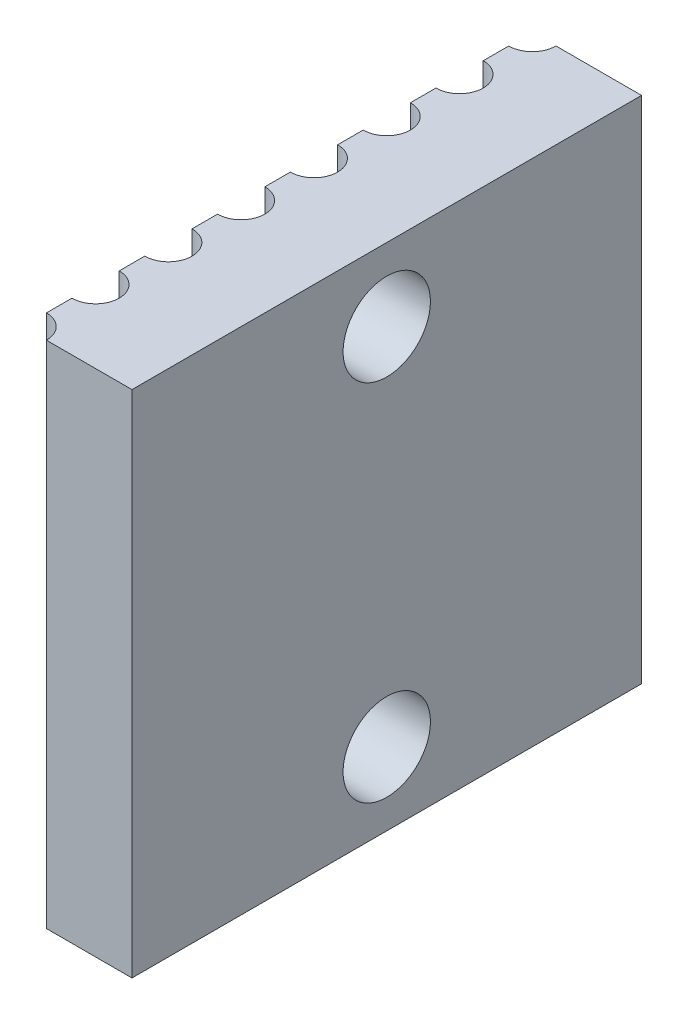
ISO-10303-21;
HEADER;
FILE_DESCRIPTION(('STEP AP214'),'2;1');
FILE_NAME('part.step','',(''),(''),'','','');
FILE_SCHEMA(('AUTOMOTIVE_DESIGN { 1 0 10303 214 1 1 1 1 }'));
ENDSEC;
DATA;
#1=APPLICATION_CONTEXT('core data for automotive mechanical design processes');
#2=APPLICATION_PROTOCOL_DEFINITION('international standard','automotive_design',2000,#1);
#3=PRODUCT_CONTEXT('',#1,'mechanical');
#4=PRODUCT('Part','Part','',(#3));
#5=PRODUCT_RELATED_PRODUCT_CATEGORY('part','',(#4));
#6=PRODUCT_DEFINITION_FORMATION('','',#4);
#7=PRODUCT_DEFINITION_CONTEXT('part definition',#1,'design');
#8=PRODUCT_DEFINITION('design','',#6,#7);
#9=PRODUCT_DEFINITION_SHAPE('','',#8);
#10=(LENGTH_UNIT() NAMED_UNIT(*) SI_UNIT(.MILLI.,.METRE.));
#11=(NAMED_UNIT(*) PLANE_ANGLE_UNIT() SI_UNIT($,.RADIAN.));
#12=(NAMED_UNIT(*) SI_UNIT($,.STERADIAN.) SOLID_ANGLE_UNIT());
#13=UNCERTAINTY_MEASURE_WITH_UNIT(LENGTH_MEASURE(1.E-05),#10,'distance_accuracy_value','');
#14=(GEOMETRIC_REPRESENTATION_CONTEXT(3) GLOBAL_UNCERTAINTY_ASSIGNED_CONTEXT((#13)) GLOBAL_UNIT_ASSIGNED_CONTEXT((#10,
#11,#12)) REPRESENTATION_CONTEXT('',''));
#15=CARTESIAN_POINT('',(0.,0.,0.));
#16=DIRECTION('',(0.,0.,1.));
#17=DIRECTION('',(1.,0.,0.));
#18=AXIS2_PLACEMENT_3D('',#15,#16,#17);
#19=CARTESIAN_POINT('',(0.,14.,14.));
#20=DIRECTION('',(1.,0.,0.));
#21=DIRECTION('',(0.,0.,-1.));
#22=AXIS2_PLACEMENT_3D('',#19,#20,#21);
#23=PLANE('',#22);
#24=DIRECTION('',(0.,-1.,0.));
#25=VECTOR('',#24,1.);
#26=CARTESIAN_POINT('',(0.,14.,6.65));
#27=LINE('',#26,#25);
#28=CARTESIAN_POINT('',(0.,13.1478240283249,6.65));
#29=VERTEX_POINT('',#28);
#30=CARTESIAN_POINT('',(0.,14.,6.65));
#31=VERTEX_POINT('',#30);
#32=EDGE_CURVE('E189',#29,#31,#27,.F.);
#33=ORIENTED_EDGE('',*,*,#32,.F.);
#34=CARTESIAN_POINT('',(0.,12.,7.));
#35=DIRECTION('',(1.,0.,0.));
#36=DIRECTION('',(0.,0.,-1.));
#37=AXIS2_PLACEMENT_3D('',#34,#35,#36);
#38=CIRCLE('',#37,1.19999999999999);
#39=CARTESIAN_POINT('',(0.,13.1478240283249,7.35));
#40=VERTEX_POINT('',#39);
#41=EDGE_CURVE('E11',#29,#40,#38,.T.);
#42=ORIENTED_EDGE('',*,*,#41,.T.);
#43=DIRECTION('',(0.,-1.,0.));
#44=VECTOR('',#43,1.);
#45=CARTESIAN_POINT('',(0.,14.,7.35));
#46=LINE('',#45,#44);
#47=CARTESIAN_POINT('',(0.,14.,7.35));
#48=VERTEX_POINT('',#47);
#49=EDGE_CURVE('E278',#48,#40,#46,.T.);
#50=ORIENTED_EDGE('',*,*,#49,.F.);
#51=DIRECTION('',(0.,0.,1.));
#52=VECTOR('',#51,1.);
#53=CARTESIAN_POINT('',(0.,14.,14.));
#54=LINE('',#53,#52);
#55=EDGE_CURVE('E198',#31,#48,#54,.T.);
#56=ORIENTED_EDGE('',*,*,#55,.F.);
#57=EDGE_LOOP('',(#33,#42,#50,#56));
#58=FACE_BOUND('',#57,.T.);
#59=ADVANCED_FACE('F31',(#58),#23,.F.);
#60=CARTESIAN_POINT('',(0.,10.8521759716751,7.35));
#61=VERTEX_POINT('',#60);
#62=CARTESIAN_POINT('',(0.,3.14782402832489,7.35));
#63=VERTEX_POINT('',#62);
#64=EDGE_CURVE('E52',#61,#63,#46,.T.);
#65=ORIENTED_EDGE('',*,*,#64,.F.);
#66=CARTESIAN_POINT('',(0.,10.8521759716751,6.65));
#67=VERTEX_POINT('',#66);
#68=EDGE_CURVE('E35',#61,#67,#38,.T.);
#69=ORIENTED_EDGE('',*,*,#68,.T.);
#70=CARTESIAN_POINT('',(0.,3.14782402832489,6.65));
#71=VERTEX_POINT('',#70);
#72=EDGE_CURVE('E193',#71,#67,#27,.F.);
#73=ORIENTED_EDGE('',*,*,#72,.F.);
#74=CARTESIAN_POINT('',(0.,2.,7.));
#75=DIRECTION('',(1.,0.,0.));
#76=DIRECTION('',(0.,0.,-1.));
#77=AXIS2_PLACEMENT_3D('',#74,#75,#76);
#78=CIRCLE('',#77,1.19999999999999);
#79=EDGE_CURVE('E271',#71,#63,#78,.T.);
#80=ORIENTED_EDGE('',*,*,#79,.T.);
#81=EDGE_LOOP('',(#65,#69,#73,#80));
#82=FACE_BOUND('',#81,.T.);
#83=ADVANCED_FACE('F276',(#82),#23,.F.);
#84=DIRECTION('',(0.,-1.,0.));
#85=VECTOR('',#84,1.);
#86=CARTESIAN_POINT('',(0.,14.,13.35));
#87=LINE('',#86,#85);
#88=CARTESIAN_POINT('',(0.,14.,13.35));
#89=VERTEX_POINT('',#88);
#90=CARTESIAN_POINT('',(0.,0.,13.35));
#91=VERTEX_POINT('',#90);
#92=EDGE_CURVE('E417',#89,#91,#87,.T.);
#93=ORIENTED_EDGE('',*,*,#92,.F.);
#94=CARTESIAN_POINT('',(0.,14.,12.65));
#95=VERTEX_POINT('',#94);
#96=EDGE_CURVE('E244',#95,#89,#54,.T.);
#97=ORIENTED_EDGE('',*,*,#96,.F.);
#98=DIRECTION('',(0.,-1.,0.));
#99=VECTOR('',#98,1.);
#100=CARTESIAN_POINT('',(0.,14.,12.65));
#101=LINE('',#100,#99);
#102=CARTESIAN_POINT('',(0.,0.,12.65));
#103=VERTEX_POINT('',#102);
#104=EDGE_CURVE('E415',#103,#95,#101,.F.);
#105=ORIENTED_EDGE('',*,*,#104,.F.);
#106=DIRECTION('',(0.,0.,1.));
#107=VECTOR('',#106,1.);
#108=CARTESIAN_POINT('',(0.,0.,14.));
#109=LINE('',#108,#107);
#110=EDGE_CURVE('E238',#103,#91,#109,.T.);
#111=ORIENTED_EDGE('',*,*,#110,.T.);
#112=EDGE_LOOP('',(#93,#97,#105,#111));
#113=FACE_BOUND('',#112,.T.);
#114=ADVANCED_FACE('F33',(#113),#23,.F.);
#115=CARTESIAN_POINT('',(0.,14.,0.));
#116=DIRECTION('',(0.,-1.,0.));
#117=DIRECTION('',(0.,0.,-1.));
#118=AXIS2_PLACEMENT_3D('',#115,#116,#117);
#119=PLANE('',#118);
#120=CARTESIAN_POINT('',(1.46642216231412E-13,14.,14.));
#121=DIRECTION('',(0.,1.,0.));
#122=DIRECTION('',(0.,0.,1.));
#123=AXIS2_PLACEMENT_3D('',#120,#121,#122);
#124=CIRCLE('',#123,0.65);
#125=CARTESIAN_POINT('',(0.650000000000147,14.,14.));
#126=VERTEX_POINT('',#125);
#127=EDGE_CURVE('E319',#126,#89,#124,.T.);
#128=ORIENTED_EDGE('',*,*,#127,.F.);
#129=DIRECTION('',(1.,0.,0.));
#130=VECTOR('',#129,1.);
#131=CARTESIAN_POINT('',(3.,14.,14.));
#132=LINE('',#131,#130);
#133=CARTESIAN_POINT('',(3.,14.,14.));
#134=VERTEX_POINT('',#133);
#135=EDGE_CURVE('E242',#126,#134,#132,.T.);
#136=ORIENTED_EDGE('',*,*,#135,.T.);
#137=DIRECTION('',(0.,0.,-1.));
#138=VECTOR('',#137,1.);
#139=CARTESIAN_POINT('',(3.,14.,0.));
#140=LINE('',#139,#138);
#141=CARTESIAN_POINT('',(3.,14.,0.));
#142=VERTEX_POINT('',#141);
#143=EDGE_CURVE('E246',#134,#142,#140,.T.);
#144=ORIENTED_EDGE('',*,*,#143,.T.);
#145=DIRECTION('',(-1.,0.,0.));
#146=VECTOR('',#145,1.);
#147=CARTESIAN_POINT('',(0.,14.,0.));
#148=LINE('',#147,#146);
#149=CARTESIAN_POINT('',(0.65,14.,0.));
#150=VERTEX_POINT('',#149);
#151=EDGE_CURVE('E248',#142,#150,#148,.T.);
#152=ORIENTED_EDGE('',*,*,#151,.T.);
#153=CARTESIAN_POINT('',(0.,14.,0.));
#154=DIRECTION('',(0.,1.,0.));
#155=DIRECTION('',(0.,0.,1.));
#156=AXIS2_PLACEMENT_3D('',#153,#154,#155);
#157=CIRCLE('',#156,0.65);
#158=CARTESIAN_POINT('',(0.,14.,0.65));
#159=VERTEX_POINT('',#158);
#160=EDGE_CURVE('E230',#159,#150,#157,.T.);
#161=ORIENTED_EDGE('',*,*,#160,.F.);
#162=CARTESIAN_POINT('',(0.,14.,1.35));
#163=VERTEX_POINT('',#162);
#164=EDGE_CURVE('E239',#159,#163,#54,.T.);
#165=ORIENTED_EDGE('',*,*,#164,.T.);
#166=CARTESIAN_POINT('',(0.,14.,2.));
#167=DIRECTION('',(0.,1.,0.));
#168=DIRECTION('',(0.,0.,1.));
#169=AXIS2_PLACEMENT_3D('',#166,#167,#168);
#170=CIRCLE('',#169,0.65);
#171=CARTESIAN_POINT('',(0.,14.,2.65));
#172=VERTEX_POINT('',#171);
#173=EDGE_CURVE('E221',#172,#163,#170,.T.);
#174=ORIENTED_EDGE('',*,*,#173,.F.);
#175=CARTESIAN_POINT('',(0.,14.,3.35));
#176=VERTEX_POINT('',#175);
#177=EDGE_CURVE('E243',#172,#176,#54,.T.);
#178=ORIENTED_EDGE('',*,*,#177,.T.);
#179=CARTESIAN_POINT('',(0.,14.,4.));
#180=DIRECTION('',(0.,1.,0.));
#181=DIRECTION('',(0.,0.,1.));
#182=AXIS2_PLACEMENT_3D('',#179,#180,#181);
#183=CIRCLE('',#182,0.65);
#184=CARTESIAN_POINT('',(0.,14.,4.65));
#185=VERTEX_POINT('',#184);
#186=EDGE_CURVE('E209',#185,#176,#183,.T.);
#187=ORIENTED_EDGE('',*,*,#186,.F.);
#188=CARTESIAN_POINT('',(0.,14.,5.35));
#189=VERTEX_POINT('',#188);
#190=EDGE_CURVE('E397',#185,#189,#54,.T.);
#191=ORIENTED_EDGE('',*,*,#190,.T.);
#192=CARTESIAN_POINT('',(0.,14.,6.));
#193=DIRECTION('',(0.,1.,0.));
#194=DIRECTION('',(0.,0.,1.));
#195=AXIS2_PLACEMENT_3D('',#192,#193,#194);
#196=CIRCLE('',#195,0.65);
#197=EDGE_CURVE('E202',#31,#189,#196,.T.);
#198=ORIENTED_EDGE('',*,*,#197,.F.);
#199=ORIENTED_EDGE('',*,*,#55,.T.);
#200=CARTESIAN_POINT('',(0.,14.,8.));
#201=DIRECTION('',(0.,1.,0.));
#202=DIRECTION('',(0.,0.,1.));
#203=AXIS2_PLACEMENT_3D('',#200,#201,#202);
#204=CIRCLE('',#203,0.65);
#205=CARTESIAN_POINT('',(0.,14.,8.65));
#206=VERTEX_POINT('',#205);
#207=EDGE_CURVE('E439',#206,#48,#204,.T.);
#208=ORIENTED_EDGE('',*,*,#207,.F.);
#209=CARTESIAN_POINT('',(0.,14.,9.35));
#210=VERTEX_POINT('',#209);
#211=EDGE_CURVE('E400',#206,#210,#54,.T.);
#212=ORIENTED_EDGE('',*,*,#211,.T.);
#213=CARTESIAN_POINT('',(1.04744440165294E-13,14.,10.));
#214=DIRECTION('',(0.,1.,0.));
#215=DIRECTION('',(0.,0.,1.));
#216=AXIS2_PLACEMENT_3D('',#213,#214,#215);
#217=CIRCLE('',#216,0.65);
#218=CARTESIAN_POINT('',(0.,14.,10.65));
#219=VERTEX_POINT('',#218);
#220=EDGE_CURVE('E430',#219,#210,#217,.T.);
#221=ORIENTED_EDGE('',*,*,#220,.F.);
#222=CARTESIAN_POINT('',(0.,14.,11.35));
#223=VERTEX_POINT('',#222);
#224=EDGE_CURVE('E403',#219,#223,#54,.T.);
#225=ORIENTED_EDGE('',*,*,#224,.T.);
#226=CARTESIAN_POINT('',(1.25693328198353E-13,14.,12.));
#227=DIRECTION('',(0.,1.,0.));
#228=DIRECTION('',(0.,0.,1.));
#229=AXIS2_PLACEMENT_3D('',#226,#227,#228);
#230=CIRCLE('',#229,0.65);
#231=EDGE_CURVE('E412',#95,#223,#230,.T.);
#232=ORIENTED_EDGE('',*,*,#231,.F.);
#233=ORIENTED_EDGE('',*,*,#96,.T.);
#234=EDGE_LOOP('',(#128,#136,#144,#152,#161,#165,#174,#178,#187,#191,#198,#199,#208,#212,#221,
#225,#232,#233));
#235=FACE_BOUND('',#234,.T.);
#236=ADVANCED_FACE('F338',(#235),#119,.F.);
#237=CARTESIAN_POINT('',(0.,0.,0.));
#238=DIRECTION('',(0.,-1.,0.));
#239=DIRECTION('',(0.,0.,-1.));
#240=AXIS2_PLACEMENT_3D('',#237,#238,#239);
#241=PLANE('',#240);
#242=DIRECTION('',(1.,0.,0.));
#243=VECTOR('',#242,1.);
#244=CARTESIAN_POINT('',(3.,0.,14.));
#245=LINE('',#244,#243);
#246=CARTESIAN_POINT('',(0.650000000000147,0.,14.));
#247=VERTEX_POINT('',#246);
#248=CARTESIAN_POINT('',(3.,0.,14.));
#249=VERTEX_POINT('',#248);
#250=EDGE_CURVE('E255',#247,#249,#245,.T.);
#251=ORIENTED_EDGE('',*,*,#250,.F.);
#252=CARTESIAN_POINT('',(1.46642216231412E-13,0.,14.));
#253=DIRECTION('',(0.,1.,0.));
#254=DIRECTION('',(0.,0.,1.));
#255=AXIS2_PLACEMENT_3D('',#252,#253,#254);
#256=CIRCLE('',#255,0.65);
#257=EDGE_CURVE('E318',#247,#91,#256,.T.);
#258=ORIENTED_EDGE('',*,*,#257,.T.);
#259=ORIENTED_EDGE('',*,*,#110,.F.);
#260=CARTESIAN_POINT('',(1.25693328198353E-13,0.,12.));
#261=DIRECTION('',(0.,1.,0.));
#262=DIRECTION('',(0.,0.,1.));
#263=AXIS2_PLACEMENT_3D('',#260,#261,#262);
#264=CIRCLE('',#263,0.65);
#265=CARTESIAN_POINT('',(0.,0.,11.35));
#266=VERTEX_POINT('',#265);
#267=EDGE_CURVE('E420',#103,#266,#264,.T.);
#268=ORIENTED_EDGE('',*,*,#267,.T.);
#269=CARTESIAN_POINT('',(0.,0.,10.65));
#270=VERTEX_POINT('',#269);
#271=EDGE_CURVE('E460',#270,#266,#109,.T.);
#272=ORIENTED_EDGE('',*,*,#271,.F.);
#273=CARTESIAN_POINT('',(1.04744440165294E-13,0.,10.));
#274=DIRECTION('',(0.,1.,0.));
#275=DIRECTION('',(0.,0.,1.));
#276=AXIS2_PLACEMENT_3D('',#273,#274,#275);
#277=CIRCLE('',#276,0.65);
#278=CARTESIAN_POINT('',(0.,0.,9.35));
#279=VERTEX_POINT('',#278);
#280=EDGE_CURVE('E429',#270,#279,#277,.T.);
#281=ORIENTED_EDGE('',*,*,#280,.T.);
#282=CARTESIAN_POINT('',(0.,0.,8.65));
#283=VERTEX_POINT('',#282);
#284=EDGE_CURVE('E458',#283,#279,#109,.T.);
#285=ORIENTED_EDGE('',*,*,#284,.F.);
#286=CARTESIAN_POINT('',(0.,0.,8.));
#287=DIRECTION('',(0.,1.,0.));
#288=DIRECTION('',(0.,0.,1.));
#289=AXIS2_PLACEMENT_3D('',#286,#287,#288);
#290=CIRCLE('',#289,0.65);
#291=CARTESIAN_POINT('',(0.,0.,7.35));
#292=VERTEX_POINT('',#291);
#293=EDGE_CURVE('E438',#283,#292,#290,.T.);
#294=ORIENTED_EDGE('',*,*,#293,.T.);
#295=CARTESIAN_POINT('',(0.,0.,6.65));
#296=VERTEX_POINT('',#295);
#297=EDGE_CURVE('E454',#296,#292,#109,.T.);
#298=ORIENTED_EDGE('',*,*,#297,.F.);
#299=CARTESIAN_POINT('',(0.,0.,6.));
#300=DIRECTION('',(0.,1.,0.));
#301=DIRECTION('',(0.,0.,1.));
#302=AXIS2_PLACEMENT_3D('',#299,#300,#301);
#303=CIRCLE('',#302,0.65);
#304=CARTESIAN_POINT('',(0.,0.,5.35));
#305=VERTEX_POINT('',#304);
#306=EDGE_CURVE('E447',#296,#305,#303,.T.);
#307=ORIENTED_EDGE('',*,*,#306,.T.);
#308=CARTESIAN_POINT('',(0.,0.,4.65));
#309=VERTEX_POINT('',#308);
#310=EDGE_CURVE('E452',#309,#305,#109,.T.);
#311=ORIENTED_EDGE('',*,*,#310,.F.);
#312=CARTESIAN_POINT('',(0.,0.,4.));
#313=DIRECTION('',(0.,1.,0.));
#314=DIRECTION('',(0.,0.,1.));
#315=AXIS2_PLACEMENT_3D('',#312,#313,#314);
#316=CIRCLE('',#315,0.65);
#317=CARTESIAN_POINT('',(0.,0.,3.35));
#318=VERTEX_POINT('',#317);
#319=EDGE_CURVE('E206',#309,#318,#316,.T.);
#320=ORIENTED_EDGE('',*,*,#319,.T.);
#321=CARTESIAN_POINT('',(0.,0.,2.65));
#322=VERTEX_POINT('',#321);
#323=EDGE_CURVE('E256',#322,#318,#109,.T.);
#324=ORIENTED_EDGE('',*,*,#323,.F.);
#325=CARTESIAN_POINT('',(0.,0.,2.));
#326=DIRECTION('',(0.,1.,0.));
#327=DIRECTION('',(0.,0.,1.));
#328=AXIS2_PLACEMENT_3D('',#325,#326,#327);
#329=CIRCLE('',#328,0.65);
#330=CARTESIAN_POINT('',(0.,0.,1.35));
#331=VERTEX_POINT('',#330);
#332=EDGE_CURVE('E220',#322,#331,#329,.T.);
#333=ORIENTED_EDGE('',*,*,#332,.T.);
#334=CARTESIAN_POINT('',(0.,0.,0.65));
#335=VERTEX_POINT('',#334);
#336=EDGE_CURVE('E252',#335,#331,#109,.T.);
#337=ORIENTED_EDGE('',*,*,#336,.F.);
#338=CARTESIAN_POINT('',(0.,0.,0.));
#339=DIRECTION('',(0.,1.,0.));
#340=DIRECTION('',(0.,0.,1.));
#341=AXIS2_PLACEMENT_3D('',#338,#339,#340);
#342=CIRCLE('',#341,0.65);
#343=CARTESIAN_POINT('',(0.65,0.,0.));
#344=VERTEX_POINT('',#343);
#345=EDGE_CURVE('E229',#335,#344,#342,.T.);
#346=ORIENTED_EDGE('',*,*,#345,.T.);
#347=DIRECTION('',(-1.,0.,0.));
#348=VECTOR('',#347,1.);
#349=CARTESIAN_POINT('',(0.,0.,0.));
#350=LINE('',#349,#348);
#351=CARTESIAN_POINT('',(3.,0.,0.));
#352=VERTEX_POINT('',#351);
#353=EDGE_CURVE('E260',#352,#344,#350,.T.);
#354=ORIENTED_EDGE('',*,*,#353,.F.);
#355=DIRECTION('',(0.,0.,-1.));
#356=VECTOR('',#355,1.);
#357=CARTESIAN_POINT('',(3.,0.,0.));
#358=LINE('',#357,#356);
#359=EDGE_CURVE('E258',#249,#352,#358,.T.);
#360=ORIENTED_EDGE('',*,*,#359,.F.);
#361=EDGE_LOOP('',(#251,#258,#259,#268,#272,#281,#285,#294,#298,#307,#311,#320,#324,#333,#337,
#346,#354,#360));
#362=FACE_BOUND('',#361,.T.);
#363=ADVANCED_FACE('F341',(#362),#241,.T.);
#364=CARTESIAN_POINT('',(3.,14.,14.));
#365=DIRECTION('',(0.,0.,-1.));
#366=DIRECTION('',(-1.,0.,0.));
#367=AXIS2_PLACEMENT_3D('',#364,#365,#366);
#368=PLANE('',#367);
#369=DIRECTION('',(0.,-1.,0.));
#370=VECTOR('',#369,1.);
#371=CARTESIAN_POINT('',(0.650000000000147,14.,14.));
#372=LINE('',#371,#370);
#373=EDGE_CURVE('E268',#247,#126,#372,.F.);
#374=ORIENTED_EDGE('',*,*,#373,.F.);
#375=ORIENTED_EDGE('',*,*,#250,.T.);
#376=DIRECTION('',(0.,-1.,0.));
#377=VECTOR('',#376,1.);
#378=CARTESIAN_POINT('',(3.,14.,14.));
#379=LINE('',#378,#377);
#380=EDGE_CURVE('E265',#134,#249,#379,.T.);
#381=ORIENTED_EDGE('',*,*,#380,.F.);
#382=ORIENTED_EDGE('',*,*,#135,.F.);
#383=EDGE_LOOP('',(#374,#375,#381,#382));
#384=FACE_BOUND('',#383,.T.);
#385=ADVANCED_FACE('F345',(#384),#368,.F.);
#386=DIRECTION('',(0.,-1.,0.));
#387=VECTOR('',#386,1.);
#388=CARTESIAN_POINT('',(0.,14.,11.35));
#389=LINE('',#388,#387);
#390=EDGE_CURVE('E425',#223,#266,#389,.T.);
#391=ORIENTED_EDGE('',*,*,#390,.F.);
#392=ORIENTED_EDGE('',*,*,#224,.F.);
#393=DIRECTION('',(0.,-1.,0.));
#394=VECTOR('',#393,1.);
#395=CARTESIAN_POINT('',(0.,14.,10.65));
#396=LINE('',#395,#394);
#397=EDGE_CURVE('E436',#270,#219,#396,.F.);
#398=ORIENTED_EDGE('',*,*,#397,.F.);
#399=ORIENTED_EDGE('',*,*,#271,.T.);
#400=EDGE_LOOP('',(#391,#392,#398,#399));
#401=FACE_BOUND('',#400,.T.);
#402=ADVANCED_FACE('F354',(#401),#23,.F.);
#403=DIRECTION('',(0.,-1.,0.));
#404=VECTOR('',#403,1.);
#405=CARTESIAN_POINT('',(0.,14.,9.35));
#406=LINE('',#405,#404);
#407=EDGE_CURVE('E432',#210,#279,#406,.T.);
#408=ORIENTED_EDGE('',*,*,#407,.F.);
#409=ORIENTED_EDGE('',*,*,#211,.F.);
#410=DIRECTION('',(0.,-1.,0.));
#411=VECTOR('',#410,1.);
#412=CARTESIAN_POINT('',(0.,14.,8.65));
#413=LINE('',#412,#411);
#414=EDGE_CURVE('E445',#283,#206,#413,.F.);
#415=ORIENTED_EDGE('',*,*,#414,.F.);
#416=ORIENTED_EDGE('',*,*,#284,.T.);
#417=EDGE_LOOP('',(#408,#409,#415,#416));
#418=FACE_BOUND('',#417,.T.);
#419=ADVANCED_FACE('F359',(#418),#23,.F.);
#420=CARTESIAN_POINT('',(0.,0.852175971675108,7.35));
#421=VERTEX_POINT('',#420);
#422=EDGE_CURVE('E441',#421,#292,#46,.T.);
#423=ORIENTED_EDGE('',*,*,#422,.F.);
#424=CARTESIAN_POINT('',(0.,0.852175971675108,6.65));
#425=VERTEX_POINT('',#424);
#426=EDGE_CURVE('E269',#421,#425,#78,.T.);
#427=ORIENTED_EDGE('',*,*,#426,.T.);
#428=EDGE_CURVE('E201',#296,#425,#27,.F.);
#429=ORIENTED_EDGE('',*,*,#428,.F.);
#430=ORIENTED_EDGE('',*,*,#297,.T.);
#431=EDGE_LOOP('',(#423,#427,#429,#430));
#432=FACE_BOUND('',#431,.T.);
#433=ADVANCED_FACE('F481',(#432),#23,.F.);
#434=DIRECTION('',(0.,-1.,0.));
#435=VECTOR('',#434,1.);
#436=CARTESIAN_POINT('',(0.,14.,5.35));
#437=LINE('',#436,#435);
#438=EDGE_CURVE('E199',#189,#305,#437,.T.);
#439=ORIENTED_EDGE('',*,*,#438,.F.);
#440=ORIENTED_EDGE('',*,*,#190,.F.);
#441=DIRECTION('',(0.,-1.,0.));
#442=VECTOR('',#441,1.);
#443=CARTESIAN_POINT('',(0.,14.,4.65));
#444=LINE('',#443,#442);
#445=EDGE_CURVE('E218',#309,#185,#444,.F.);
#446=ORIENTED_EDGE('',*,*,#445,.F.);
#447=ORIENTED_EDGE('',*,*,#310,.T.);
#448=EDGE_LOOP('',(#439,#440,#446,#447));
#449=FACE_BOUND('',#448,.T.);
#450=ADVANCED_FACE('F377',(#449),#23,.F.);
#451=DIRECTION('',(0.,-1.,0.));
#452=VECTOR('',#451,1.);
#453=CARTESIAN_POINT('',(0.,14.,3.35));
#454=LINE('',#453,#452);
#455=EDGE_CURVE('E215',#176,#318,#454,.T.);
#456=ORIENTED_EDGE('',*,*,#455,.F.);
#457=ORIENTED_EDGE('',*,*,#177,.F.);
#458=DIRECTION('',(0.,-1.,0.));
#459=VECTOR('',#458,1.);
#460=CARTESIAN_POINT('',(0.,14.,2.65));
#461=LINE('',#460,#459);
#462=EDGE_CURVE('E227',#322,#172,#461,.F.);
#463=ORIENTED_EDGE('',*,*,#462,.F.);
#464=ORIENTED_EDGE('',*,*,#323,.T.);
#465=EDGE_LOOP('',(#456,#457,#463,#464));
#466=FACE_BOUND('',#465,.T.);
#467=ADVANCED_FACE('F372',(#466),#23,.F.);
#468=DIRECTION('',(0.,-1.,0.));
#469=VECTOR('',#468,1.);
#470=CARTESIAN_POINT('',(0.,14.,1.35));
#471=LINE('',#470,#469);
#472=EDGE_CURVE('E223',#163,#331,#471,.T.);
#473=ORIENTED_EDGE('',*,*,#472,.F.);
#474=ORIENTED_EDGE('',*,*,#164,.F.);
#475=DIRECTION('',(0.,-1.,0.));
#476=VECTOR('',#475,1.);
#477=CARTESIAN_POINT('',(0.,14.,0.65));
#478=LINE('',#477,#476);
#479=EDGE_CURVE('E236',#335,#159,#478,.F.);
#480=ORIENTED_EDGE('',*,*,#479,.F.);
#481=ORIENTED_EDGE('',*,*,#336,.T.);
#482=EDGE_LOOP('',(#473,#474,#480,#481));
#483=FACE_BOUND('',#482,.T.);
#484=ADVANCED_FACE('F349',(#483),#23,.F.);
#485=CARTESIAN_POINT('',(0.,14.,0.));
#486=DIRECTION('',(0.,0.,1.));
#487=DIRECTION('',(1.,0.,0.));
#488=AXIS2_PLACEMENT_3D('',#485,#486,#487);
#489=PLANE('',#488);
#490=DIRECTION('',(0.,-1.,0.));
#491=VECTOR('',#490,1.);
#492=CARTESIAN_POINT('',(0.65,14.,0.));
#493=LINE('',#492,#491);
#494=EDGE_CURVE('E232',#150,#344,#493,.T.);
#495=ORIENTED_EDGE('',*,*,#494,.F.);
#496=ORIENTED_EDGE('',*,*,#151,.F.);
#497=DIRECTION('',(0.,-1.,0.));
#498=VECTOR('',#497,1.);
#499=CARTESIAN_POINT('',(3.,14.,0.));
#500=LINE('',#499,#498);
#501=EDGE_CURVE('E251',#142,#352,#500,.T.);
#502=ORIENTED_EDGE('',*,*,#501,.T.);
#503=ORIENTED_EDGE('',*,*,#353,.T.);
#504=EDGE_LOOP('',(#495,#496,#502,#503));
#505=FACE_BOUND('',#504,.T.);
#506=ADVANCED_FACE('F346',(#505),#489,.F.);
#507=CARTESIAN_POINT('',(3.,14.,0.));
#508=DIRECTION('',(-1.,0.,0.));
#509=DIRECTION('',(0.,0.,1.));
#510=AXIS2_PLACEMENT_3D('',#507,#508,#509);
#511=PLANE('',#510);
#512=CARTESIAN_POINT('',(3.,12.,7.));
#513=DIRECTION('',(1.,0.,0.));
#514=DIRECTION('',(0.,0.,-1.));
#515=AXIS2_PLACEMENT_3D('',#512,#513,#514);
#516=CIRCLE('',#515,1.19999999999999);
#517=CARTESIAN_POINT('',(3.,12.,5.80000000000001));
#518=VERTEX_POINT('',#517);
#519=EDGE_CURVE('E279',#518,#518,#516,.T.);
#520=ORIENTED_EDGE('',*,*,#519,.F.);
#521=EDGE_LOOP('',(#520));
#522=FACE_BOUND('',#521,.T.);
#523=CARTESIAN_POINT('',(3.,2.,7.));
#524=DIRECTION('',(1.,0.,0.));
#525=DIRECTION('',(0.,0.,-1.));
#526=AXIS2_PLACEMENT_3D('',#523,#524,#525);
#527=CIRCLE('',#526,1.19999999999999);
#528=CARTESIAN_POINT('',(3.,2.,5.80000000000001));
#529=VERTEX_POINT('',#528);
#530=EDGE_CURVE('E194',#529,#529,#527,.T.);
#531=ORIENTED_EDGE('',*,*,#530,.F.);
#532=EDGE_LOOP('',(#531));
#533=FACE_BOUND('',#532,.T.);
#534=ORIENTED_EDGE('',*,*,#359,.T.);
#535=ORIENTED_EDGE('',*,*,#501,.F.);
#536=ORIENTED_EDGE('',*,*,#143,.F.);
#537=ORIENTED_EDGE('',*,*,#380,.T.);
#538=EDGE_LOOP('',(#534,#535,#536,#537));
#539=FACE_BOUND('',#538,.T.);
#540=ADVANCED_FACE('F336',(#522,#533,#539),#511,.F.);
#541=CARTESIAN_POINT('',(0.,14.,0.));
#542=DIRECTION('',(0.,-1.,0.));
#543=DIRECTION('',(0.,0.,-1.));
#544=AXIS2_PLACEMENT_3D('',#541,#542,#543);
#545=CYLINDRICAL_SURFACE('',#544,0.65);
#546=ORIENTED_EDGE('',*,*,#479,.T.);
#547=ORIENTED_EDGE('',*,*,#160,.T.);
#548=ORIENTED_EDGE('',*,*,#494,.T.);
#549=ORIENTED_EDGE('',*,*,#345,.F.);
#550=EDGE_LOOP('',(#546,#547,#548,#549));
#551=FACE_BOUND('',#550,.T.);
#552=ADVANCED_FACE('F332',(#551),#545,.F.);
#553=CARTESIAN_POINT('',(0.,14.,2.));
#554=DIRECTION('',(0.,-1.,0.));
#555=DIRECTION('',(0.,0.,-1.));
#556=AXIS2_PLACEMENT_3D('',#553,#554,#555);
#557=CYLINDRICAL_SURFACE('',#556,0.65);
#558=ORIENTED_EDGE('',*,*,#462,.T.);
#559=ORIENTED_EDGE('',*,*,#173,.T.);
#560=ORIENTED_EDGE('',*,*,#472,.T.);
#561=ORIENTED_EDGE('',*,*,#332,.F.);
#562=EDGE_LOOP('',(#558,#559,#560,#561));
#563=FACE_BOUND('',#562,.T.);
#564=ADVANCED_FACE('F328',(#563),#557,.F.);
#565=CARTESIAN_POINT('',(0.,14.,4.));
#566=DIRECTION('',(0.,-1.,0.));
#567=DIRECTION('',(0.,0.,-1.));
#568=AXIS2_PLACEMENT_3D('',#565,#566,#567);
#569=CYLINDRICAL_SURFACE('',#568,0.65);
#570=ORIENTED_EDGE('',*,*,#445,.T.);
#571=ORIENTED_EDGE('',*,*,#186,.T.);
#572=ORIENTED_EDGE('',*,*,#455,.T.);
#573=ORIENTED_EDGE('',*,*,#319,.F.);
#574=EDGE_LOOP('',(#570,#571,#572,#573));
#575=FACE_BOUND('',#574,.T.);
#576=ADVANCED_FACE('F324',(#575),#569,.F.);
#577=CARTESIAN_POINT('',(0.,14.,6.));
#578=DIRECTION('',(0.,-1.,0.));
#579=DIRECTION('',(0.,0.,-1.));
#580=AXIS2_PLACEMENT_3D('',#577,#578,#579);
#581=CYLINDRICAL_SURFACE('',#580,0.65);
#582=CARTESIAN_POINT('',(0.,13.1478240283249,6.65));
#583=CARTESIAN_POINT('',(0.0346501413448795,13.1477908048386,6.65003734324628));
#584=CARTESIAN_POINT('',(0.0692983994448053,13.1469788785083,6.64723144500558));
#585=CARTESIAN_POINT('',(0.137633739465714,13.143549426961,6.63619330371275));
#586=CARTESIAN_POINT('',(0.171320663092026,13.140931606149,6.62796017232246));
#587=CARTESIAN_POINT('',(0.236794891055143,13.1336385741834,6.6063176331573));
#588=CARTESIAN_POINT('',(0.268580368885156,13.1289614197922,6.59290333778039));
#589=CARTESIAN_POINT('',(0.329261384599495,13.1171287377228,6.56147322142995));
#590=CARTESIAN_POINT('',(0.358158982834097,13.1099749934652,6.54346071412578));
#591=CARTESIAN_POINT('',(0.411872078095336,13.0928773664219,6.50394197123819));
#592=CARTESIAN_POINT('',(0.436739230743809,13.0829741032483,6.48248838627288));
#593=CARTESIAN_POINT('',(0.48227648693446,13.0600231749308,6.43697347393383));
#594=CARTESIAN_POINT('',(0.502946600915761,13.046975517608,6.41291215304645));
#595=CARTESIAN_POINT('',(0.539688331972896,13.0177242324307,6.36356220362988));
#596=CARTESIAN_POINT('',(0.555789112306365,13.0015417820809,6.33828262128023));
#597=CARTESIAN_POINT('',(0.583670027676762,12.9660939158668,6.28752315569854));
#598=CARTESIAN_POINT('',(0.595448769537224,12.9468275087814,6.26204321057969));
#599=CARTESIAN_POINT('',(0.618278076878496,12.8987758573496,6.20372875263726));
#600=CARTESIAN_POINT('',(0.627852654169206,12.8689302905678,6.17119005882525));
#601=CARTESIAN_POINT('',(0.641572457257693,12.80516103158,6.10909534355092));
#602=CARTESIAN_POINT('',(0.645706561509835,12.7712291399905,6.07954554547072));
#603=CARTESIAN_POINT('',(0.650910734904557,12.6876342735759,6.01468338934792));
#604=CARTESIAN_POINT('',(0.65039797967739,12.6366274531625,5.98098397334567));
#605=CARTESIAN_POINT('',(0.645959056172745,12.5302159523579,5.9217615080421));
#606=CARTESIAN_POINT('',(0.642027935830684,12.4748049977107,5.89625039428304));
#607=CARTESIAN_POINT('',(0.633629992618667,12.3592982890892,5.85335542198851));
#608=CARTESIAN_POINT('',(0.629151889053457,12.2991181344551,5.83620039929432));
#609=CARTESIAN_POINT('',(0.622188674207643,12.176775155878,5.81145490114946));
#610=CARTESIAN_POINT('',(0.619701019535689,12.1146149680254,5.80385221263541));
#611=CARTESIAN_POINT('',(0.617906498957406,11.9857258591546,5.79824290605903));
#612=CARTESIAN_POINT('',(0.618817868996936,11.918963578419,5.80089509693014));
#613=CARTESIAN_POINT('',(0.623821242421931,11.7868428680716,5.81720436433241));
#614=CARTESIAN_POINT('',(0.627918137453848,11.721486756512,5.83087836698404));
#615=CARTESIAN_POINT('',(0.636844273817348,11.595052255227,5.86849519110055));
#616=CARTESIAN_POINT('',(0.641660437214143,11.5339213739737,5.89226635216418));
#617=CARTESIAN_POINT('',(0.648677521818563,11.4162391096603,5.94953137668191));
#618=CARTESIAN_POINT('',(0.650882342429682,11.3596810162359,5.98301065013334));
#619=CARTESIAN_POINT('',(0.648811933085186,11.2687985673682,6.04739341164044));
#620=CARTESIAN_POINT('',(0.646272585774628,11.2328725309225,6.07608928910299));
#621=CARTESIAN_POINT('',(0.636141889005886,11.164941102771,6.1370142699432));
#622=CARTESIAN_POINT('',(0.628559567202774,11.1329288258787,6.16923697383092));
#623=CARTESIAN_POINT('',(0.608735694050158,11.0791592897825,6.22968951739501));
#624=CARTESIAN_POINT('',(0.597606631643845,11.0565986057113,6.25756471219021));
#625=CARTESIAN_POINT('',(0.570228474342074,11.0151224443637,6.3135405070359));
#626=CARTESIAN_POINT('',(0.55398156896938,10.996205413821,6.34164100569566));
#627=CARTESIAN_POINT('',(0.515994014488423,10.962171486835,6.39670326884352));
#628=CARTESIAN_POINT('',(0.494224369094,10.9470755150709,6.42365811791013));
#629=CARTESIAN_POINT('',(0.445510458676812,10.9207418919478,6.47461714846638));
#630=CARTESIAN_POINT('',(0.418567617088948,10.9095031816066,6.49862213865387));
#631=CARTESIAN_POINT('',(0.362951505397794,10.8913556281102,6.54024195519866));
#632=CARTESIAN_POINT('',(0.334661763132314,10.8841448246627,6.55824039214969));
#633=CARTESIAN_POINT('',(0.2752310490196,10.8721550904752,6.58981481506002));
#634=CARTESIAN_POINT('',(0.244088673065045,10.8673773650029,6.60338860799871));
#635=CARTESIAN_POINT('',(0.178085193159769,10.8596522379176,6.62615293914856));
#636=CARTESIAN_POINT('',(0.143114038032456,10.8568179470547,6.63506634926492));
#637=CARTESIAN_POINT('',(0.0898720805919368,10.8540158597619,6.64401019414188));
#638=CARTESIAN_POINT('',(0.0719806883109909,10.8533234136176,6.64625378140673));
#639=CARTESIAN_POINT('',(0.0360626793937785,10.8524047583713,6.64924868124926));
#640=CARTESIAN_POINT('',(0.0180360718434368,10.8521785182189,6.65000009320926));
#641=CARTESIAN_POINT('',(0.,10.8521759716751,6.65));
#642=B_SPLINE_CURVE_WITH_KNOTS('',3,(#582,#583,#584,#585,#586,#587,#588,#589,#590,#591,#592,
#593,#594,#595,#596,#597,#598,#599,#600,#601,#602,#603,#604,#605,#606,#607,#608,#609,#610,#611,
#612,#613,#614,#615,#616,#617,#618,#619,#620,#621,#622,#623,#624,#625,#626,#627,#628,#629,#630,
#631,#632,#633,#634,#635,#636,#637,#638,#639,#640,#641),.UNSPECIFIED.,.F.,.F.,(4,2,2,2,2,2,2,2,
2,2,2,2,2,2,2,2,2,2,2,2,2,2,2,2,2,2,2,2,2,4),(0.,0.103826192692925,0.207669384043581,
0.31161077508614,0.415477471908054,0.517884633335821,0.62029154004729,0.722029340111065,
0.823799905837239,0.958587610681452,1.09365042597162,1.27607550707896,1.45876530204613,
1.64621047478903,1.83341574626471,2.03284140236938,2.23257389990074,2.42903872374504,
2.6252098039224,2.76289818773353,2.90034075043382,3.01252186437776,3.12465504987341,
3.23738961888612,3.35009321266709,3.45249083461075,3.55493913178449,3.662934539904,
3.7170103888528,3.77108263610464),.UNSPECIFIED.);
#643=EDGE_CURVE('E180',#29,#67,#642,.T.);
#644=ORIENTED_EDGE('',*,*,#643,.F.);
#645=ORIENTED_EDGE('',*,*,#32,.T.);
#646=ORIENTED_EDGE('',*,*,#197,.T.);
#647=ORIENTED_EDGE('',*,*,#438,.T.);
#648=ORIENTED_EDGE('',*,*,#306,.F.);
#649=ORIENTED_EDGE('',*,*,#428,.T.);
#650=CARTESIAN_POINT('',(0.,3.14782402832489,6.65));
#651=CARTESIAN_POINT('',(0.0346501413448795,3.14779080483859,6.65003734324628));
#652=CARTESIAN_POINT('',(0.0692983994448051,3.1469788785083,6.64723144500558));
#653=CARTESIAN_POINT('',(0.137633739465714,3.14354942696097,6.63619330371275));
#654=CARTESIAN_POINT('',(0.171320663092026,3.14093160614898,6.62796017232246));
#655=CARTESIAN_POINT('',(0.236794891055143,3.13363857418343,6.6063176331573));
#656=CARTESIAN_POINT('',(0.268580368885156,3.12896141979222,6.59290333778039));
#657=CARTESIAN_POINT('',(0.329261384599495,3.11712873772284,6.56147322142995));
#658=CARTESIAN_POINT('',(0.358158982834097,3.10997499346524,6.54346071412578));
#659=CARTESIAN_POINT('',(0.411872078095336,3.0928773664219,6.50394197123819));
#660=CARTESIAN_POINT('',(0.436739230743809,3.08297410324825,6.48248838627288));
#661=CARTESIAN_POINT('',(0.482276486934459,3.06002317493077,6.43697347393383));
#662=CARTESIAN_POINT('',(0.502946600915761,3.04697551760803,6.41291215304645));
#663=CARTESIAN_POINT('',(0.539688331972896,3.01772423243069,6.36356220362987));
#664=CARTESIAN_POINT('',(0.555789112306365,3.00154178208093,6.33828262128023));
#665=CARTESIAN_POINT('',(0.583670027676762,2.96609391586676,6.28752315569854));
#666=CARTESIAN_POINT('',(0.595448769537224,2.94682750878137,6.26204321057969));
#667=CARTESIAN_POINT('',(0.618278076878497,2.89877585734957,6.20372875263726));
#668=CARTESIAN_POINT('',(0.627852654169206,2.86893029056783,6.17119005882525));
#669=CARTESIAN_POINT('',(0.641572457257693,2.80516103157999,6.10909534355092));
#670=CARTESIAN_POINT('',(0.645706561509835,2.77122913999045,6.07954554547071));
#671=CARTESIAN_POINT('',(0.650910734904557,2.68763427357589,6.01468338934792));
#672=CARTESIAN_POINT('',(0.65039797967739,2.63662745316247,5.98098397334567));
#673=CARTESIAN_POINT('',(0.645959056172745,2.53021595235791,5.9217615080421));
#674=CARTESIAN_POINT('',(0.642027935830684,2.47480499771075,5.89625039428304));
#675=CARTESIAN_POINT('',(0.633629992618667,2.35929828908923,5.85335542198851));
#676=CARTESIAN_POINT('',(0.629151889053457,2.29911813445505,5.83620039929432));
#677=CARTESIAN_POINT('',(0.622188674207643,2.17677515587797,5.81145490114946));
#678=CARTESIAN_POINT('',(0.619701019535689,2.11461496802545,5.80385221263541));
#679=CARTESIAN_POINT('',(0.617906498957406,1.98572585915461,5.79824290605903));
#680=CARTESIAN_POINT('',(0.618817868996936,1.91896357841904,5.80089509693014));
#681=CARTESIAN_POINT('',(0.623821242421931,1.78684286807158,5.81720436433241));
#682=CARTESIAN_POINT('',(0.627918137453848,1.72148675651197,5.83087836698404));
#683=CARTESIAN_POINT('',(0.636844273817348,1.59505225522697,5.86849519110055));
#684=CARTESIAN_POINT('',(0.641660437214144,1.53392137397368,5.89226635216418));
#685=CARTESIAN_POINT('',(0.648677521818563,1.41623910966026,5.94953137668191));
#686=CARTESIAN_POINT('',(0.650882342429682,1.35968101623587,5.98301065013334));
#687=CARTESIAN_POINT('',(0.648811933085186,1.26879856736821,6.04739341164045));
#688=CARTESIAN_POINT('',(0.646272585774628,1.23287253092254,6.07608928910299));
#689=CARTESIAN_POINT('',(0.636141889005886,1.16494110277101,6.1370142699432));
#690=CARTESIAN_POINT('',(0.628559567202774,1.13292882587867,6.16923697383092));
#691=CARTESIAN_POINT('',(0.608735694050158,1.07915928978247,6.22968951739502));
#692=CARTESIAN_POINT('',(0.597606631643844,1.05659860571134,6.25756471219021));
#693=CARTESIAN_POINT('',(0.570228474342073,1.01512244436368,6.3135405070359));
#694=CARTESIAN_POINT('',(0.553981568969379,0.996205413820976,6.34164100569566));
#695=CARTESIAN_POINT('',(0.515994014488422,0.962171486835006,6.39670326884352));
#696=CARTESIAN_POINT('',(0.494224369093998,0.94707551507095,6.42365811791013));
#697=CARTESIAN_POINT('',(0.44551045867681,0.920741891947786,6.47461714846638));
#698=CARTESIAN_POINT('',(0.418567617088946,0.909503181606588,6.49862213865387));
#699=CARTESIAN_POINT('',(0.362951505397791,0.891355628110166,6.54024195519866));
#700=CARTESIAN_POINT('',(0.334661763132311,0.884144824662717,6.55824039214969));
#701=CARTESIAN_POINT('',(0.275231049019598,0.87215509047524,6.58981481506002));
#702=CARTESIAN_POINT('',(0.244088673065042,0.867377365002901,6.60338860799871));
#703=CARTESIAN_POINT('',(0.178085193159767,0.85965223791762,6.62615293914856));
#704=CARTESIAN_POINT('',(0.143114038032454,0.856817947054726,6.63506634926492));
#705=CARTESIAN_POINT('',(0.0898720805919355,0.85401585976191,6.64401019414188));
#706=CARTESIAN_POINT('',(0.0719806883109899,0.853323413617557,6.64625378140673));
#707=CARTESIAN_POINT('',(0.036062679393778,0.852404758371253,6.64924868124926));
#708=CARTESIAN_POINT('',(0.0180360718434366,0.85217851821887,6.65000009320925));
#709=CARTESIAN_POINT('',(0.,0.852175971675107,6.65));
#710=B_SPLINE_CURVE_WITH_KNOTS('',3,(#650,#651,#652,#653,#654,#655,#656,#657,#658,#659,#660,
#661,#662,#663,#664,#665,#666,#667,#668,#669,#670,#671,#672,#673,#674,#675,#676,#677,#678,#679,
#680,#681,#682,#683,#684,#685,#686,#687,#688,#689,#690,#691,#692,#693,#694,#695,#696,#697,#698,
#699,#700,#701,#702,#703,#704,#705,#706,#707,#708,#709),.UNSPECIFIED.,.F.,.F.,(4,2,2,2,2,2,2,2,
2,2,2,2,2,2,2,2,2,2,2,2,2,2,2,2,2,2,2,2,2,4),(0.,0.103826192692925,0.207669384043581,
0.31161077508614,0.415477471908054,0.517884633335821,0.62029154004729,0.722029340111066,
0.82379990583724,0.958587610681452,1.09365042597162,1.27607550707896,1.45876530204613,
1.64621047478903,1.8334157462647,2.03284140236938,2.23257389990074,2.42903872374504,
2.6252098039224,2.76289818773353,2.90034075043382,3.01252186437776,3.12465504987341,
3.23738961888612,3.35009321266709,3.45249083461075,3.55493913178449,3.662934539904,
3.7170103888528,3.77108263610464),.UNSPECIFIED.);
#711=EDGE_CURVE('E313',#71,#425,#710,.T.);
#712=ORIENTED_EDGE('',*,*,#711,.F.);
#713=ORIENTED_EDGE('',*,*,#72,.T.);
#714=EDGE_LOOP('',(#644,#645,#646,#647,#648,#649,#712,#713));
#715=FACE_BOUND('',#714,.T.);
#716=ADVANCED_FACE('F188',(#715),#581,.F.);
#717=CARTESIAN_POINT('',(0.,14.,8.));
#718=DIRECTION('',(0.,-1.,0.));
#719=DIRECTION('',(0.,0.,-1.));
#720=AXIS2_PLACEMENT_3D('',#717,#718,#719);
#721=CYLINDRICAL_SURFACE('',#720,0.65);
#722=CARTESIAN_POINT('',(0.,10.8521759716751,7.35));
#723=CARTESIAN_POINT('',(0.0346501413448791,10.8522091951614,7.34996265675372));
#724=CARTESIAN_POINT('',(0.069298399444805,10.8530211214917,7.35276855499442));
#725=CARTESIAN_POINT('',(0.137633739465714,10.856450573039,7.36380669628725));
#726=CARTESIAN_POINT('',(0.171320663092026,10.859068393851,7.37203982767753));
#727=CARTESIAN_POINT('',(0.236794891055144,10.8663614258166,7.39368236684269));
#728=CARTESIAN_POINT('',(0.268580368885158,10.8710385802078,7.4070966622196));
#729=CARTESIAN_POINT('',(0.329261384599498,10.8828712622772,7.43852677857004));
#730=CARTESIAN_POINT('',(0.3581589828341,10.8900250065348,7.45653928587421));
#731=CARTESIAN_POINT('',(0.411872078095341,10.9071226335781,7.4960580287618));
#732=CARTESIAN_POINT('',(0.436739230743815,10.9170258967517,7.51751161372711));
#733=CARTESIAN_POINT('',(0.482276486934467,10.9399768250692,7.56302652606615));
#734=CARTESIAN_POINT('',(0.502946600915769,10.953024482392,7.58708784695354));
#735=CARTESIAN_POINT('',(0.539688331972906,10.9822757675693,7.63643779637011));
#736=CARTESIAN_POINT('',(0.555789112306376,10.9984582179191,7.66171737871975));
#737=CARTESIAN_POINT('',(0.583670027676774,11.0339060841332,7.71247684430144));
#738=CARTESIAN_POINT('',(0.595448769537238,11.0531724912186,7.7379567894203));
#739=CARTESIAN_POINT('',(0.618278076878512,11.1012241426504,7.79627124736273));
#740=CARTESIAN_POINT('',(0.627852654169222,11.1310697094322,7.82880994117474));
#741=CARTESIAN_POINT('',(0.64157245725771,11.19483896842,7.89090465644906));
#742=CARTESIAN_POINT('',(0.645706561509854,11.2287708600095,7.92045445452927));
#743=CARTESIAN_POINT('',(0.650910734904578,11.3123657264241,7.98531661065206));
#744=CARTESIAN_POINT('',(0.650397979677411,11.3633725468375,8.01901602665431));
#745=CARTESIAN_POINT('',(0.645959056172768,11.4697840476421,8.07823849195789));
#746=CARTESIAN_POINT('',(0.642027935830707,11.5251950022892,8.10374960571694));
#747=CARTESIAN_POINT('',(0.63362999261869,11.6407017109107,8.14664457801148));
#748=CARTESIAN_POINT('',(0.629151889053481,11.7008818655449,8.16379960070567));
#749=CARTESIAN_POINT('',(0.622188674207666,11.823224844122,8.18854509885053));
#750=CARTESIAN_POINT('',(0.619701019535712,11.8853850319745,8.19614778736459));
#751=CARTESIAN_POINT('',(0.617906498957427,12.0142741408453,8.20175709394097));
#752=CARTESIAN_POINT('',(0.618817868996956,12.0810364215809,8.19910490306987));
#753=CARTESIAN_POINT('',(0.62382124242195,12.2131571319284,8.1827956356676));
#754=CARTESIAN_POINT('',(0.627918137453866,12.278513243488,8.16912163301597));
#755=CARTESIAN_POINT('',(0.636844273817366,12.404947744773,8.13150480889946));
#756=CARTESIAN_POINT('',(0.641660437214162,12.4660786260263,8.10773364783583));
#757=CARTESIAN_POINT('',(0.648677521818582,12.5837608903397,8.05046862331811));
#758=CARTESIAN_POINT('',(0.650882342429702,12.6403189837641,8.01698934986669));
#759=CARTESIAN_POINT('',(0.648811933085209,12.7312014326318,7.95260658835958));
#760=CARTESIAN_POINT('',(0.646272585774652,12.7671274690774,7.92391071089704));
#761=CARTESIAN_POINT('',(0.636141889005912,12.835058897229,7.86298573005683));
#762=CARTESIAN_POINT('',(0.628559567202801,12.8670711741213,7.83076302616911));
#763=CARTESIAN_POINT('',(0.608735694050188,12.9208407102175,7.77031048260501));
#764=CARTESIAN_POINT('',(0.597606631643875,12.9434013942886,7.74243528780981));
#765=CARTESIAN_POINT('',(0.570228474342106,12.9848775556363,7.68645949296412));
#766=CARTESIAN_POINT('',(0.553981568969413,13.003794586179,7.65835899430436));
#767=CARTESIAN_POINT('',(0.515994014488457,13.037828513165,7.6032967311565));
#768=CARTESIAN_POINT('',(0.494224369094034,13.052924484929,7.57634188208988));
#769=CARTESIAN_POINT('',(0.445510458676848,13.0792581080522,7.52538285153363));
#770=CARTESIAN_POINT('',(0.418567617088984,13.0904968183934,7.50137786134614));
#771=CARTESIAN_POINT('',(0.36295150539783,13.1086443718898,7.45975804480135));
#772=CARTESIAN_POINT('',(0.33466176313235,13.1158551753373,7.44175960785032));
#773=CARTESIAN_POINT('',(0.275231049019637,13.1278449095248,7.41018518493999));
#774=CARTESIAN_POINT('',(0.244088673065082,13.1326226349971,7.3966113920013));
#775=CARTESIAN_POINT('',(0.178085193159801,13.1403477620824,7.37384706085144));
#776=CARTESIAN_POINT('',(0.143114038032481,13.1431820529453,7.36493365073508));
#777=CARTESIAN_POINT('',(0.089872080591952,13.1459841402381,7.35598980585812));
#778=CARTESIAN_POINT('',(0.0719806883110029,13.1466765863824,7.35374621859327));
#779=CARTESIAN_POINT('',(0.036062679393784,13.1475952416287,7.35075131875073));
#780=CARTESIAN_POINT('',(0.0180360718434391,13.1478214817811,7.34999990679074));
#781=CARTESIAN_POINT('',(0.,13.1478240283249,7.35));
#782=B_SPLINE_CURVE_WITH_KNOTS('',3,(#722,#723,#724,#725,#726,#727,#728,#729,#730,#731,#732,
#733,#734,#735,#736,#737,#738,#739,#740,#741,#742,#743,#744,#745,#746,#747,#748,#749,#750,#751,
#752,#753,#754,#755,#756,#757,#758,#759,#760,#761,#762,#763,#764,#765,#766,#767,#768,#769,#770,
#771,#772,#773,#774,#775,#776,#777,#778,#779,#780,#781),.UNSPECIFIED.,.F.,.F.,(4,2,2,2,2,2,2,2,
2,2,2,2,2,2,2,2,2,2,2,2,2,2,2,2,2,2,2,2,2,4),(0.,0.103826192692926,0.207669384043582,
0.311610775086141,0.415477471908055,0.517884633335822,0.620291540047289,0.722029340111065,
0.823799905837239,0.958587610681447,1.09365042597161,1.27607550707894,1.45876530204612,
1.64621047478901,1.83341574626468,2.03284140236936,2.23257389990072,2.42903872374502,
2.62520980392237,2.76289818773351,2.90034075043381,3.01252186437775,3.1246550498734,
3.23738961888612,3.35009321266709,3.45249083461076,3.55493913178449,3.66293453990402,
3.71701038885283,3.77108263610469),.UNSPECIFIED.);
#783=EDGE_CURVE('E46',#61,#40,#782,.T.);
#784=ORIENTED_EDGE('',*,*,#783,.F.);
#785=ORIENTED_EDGE('',*,*,#64,.T.);
#786=CARTESIAN_POINT('',(0.,0.852175971675107,7.35));
#787=CARTESIAN_POINT('',(0.0346501413448791,0.852209195161411,7.34996265675372));
#788=CARTESIAN_POINT('',(0.069298399444805,0.853021121491701,7.35276855499442));
#789=CARTESIAN_POINT('',(0.137633739465714,0.856450573039031,7.36380669628725));
#790=CARTESIAN_POINT('',(0.171320663092026,0.859068393851016,7.37203982767753));
#791=CARTESIAN_POINT('',(0.236794891055144,0.866361425816563,7.39368236684269));
#792=CARTESIAN_POINT('',(0.268580368885158,0.871038580207776,7.4070966622196));
#793=CARTESIAN_POINT('',(0.329261384599498,0.88287126227716,7.43852677857004));
#794=CARTESIAN_POINT('',(0.3581589828341,0.890025006534759,7.45653928587421));
#795=CARTESIAN_POINT('',(0.411872078095341,0.907122633578095,7.4960580287618));
#796=CARTESIAN_POINT('',(0.436739230743815,0.91702589675174,7.51751161372711));
#797=CARTESIAN_POINT('',(0.482276486934468,0.939976825069224,7.56302652606615));
#798=CARTESIAN_POINT('',(0.50294660091577,0.953024482391965,7.58708784695354));
#799=CARTESIAN_POINT('',(0.539688331972906,0.982275767569305,7.63643779637011));
#800=CARTESIAN_POINT('',(0.555789112306376,0.998458217919061,7.66171737871975));
#801=CARTESIAN_POINT('',(0.583670027676775,1.03390608413323,7.71247684430144));
#802=CARTESIAN_POINT('',(0.595448769537238,1.05317249121862,7.7379567894203));
#803=CARTESIAN_POINT('',(0.618278076878512,1.10122414265042,7.79627124736273));
#804=CARTESIAN_POINT('',(0.627852654169222,1.13106970943216,7.82880994117474));
#805=CARTESIAN_POINT('',(0.641572457257711,1.19483896842,7.89090465644906));
#806=CARTESIAN_POINT('',(0.645706561509854,1.22877086000953,7.92045445452927));
#807=CARTESIAN_POINT('',(0.650910734904578,1.31236572642409,7.98531661065206));
#808=CARTESIAN_POINT('',(0.650397979677411,1.36337254683751,8.01901602665432));
#809=CARTESIAN_POINT('',(0.645959056172768,1.46978404764206,8.07823849195789));
#810=CARTESIAN_POINT('',(0.642027935830707,1.52519500228922,8.10374960571694));
#811=CARTESIAN_POINT('',(0.63362999261869,1.64070171091074,8.14664457801148));
#812=CARTESIAN_POINT('',(0.629151889053481,1.70088186554491,8.16379960070567));
#813=CARTESIAN_POINT('',(0.622188674207666,1.823224844122,8.18854509885053));
#814=CARTESIAN_POINT('',(0.619701019535712,1.88538503197451,8.19614778736459));
#815=CARTESIAN_POINT('',(0.617906498957427,2.01427414084535,8.20175709394097));
#816=CARTESIAN_POINT('',(0.618817868996956,2.08103642158092,8.19910490306987));
#817=CARTESIAN_POINT('',(0.62382124242195,2.21315713192838,8.1827956356676));
#818=CARTESIAN_POINT('',(0.627918137453867,2.27851324348799,8.16912163301596));
#819=CARTESIAN_POINT('',(0.636844273817367,2.40494774477299,8.13150480889946));
#820=CARTESIAN_POINT('',(0.641660437214162,2.46607862602629,8.10773364783583));
#821=CARTESIAN_POINT('',(0.648677521818582,2.58376089033971,8.05046862331811));
#822=CARTESIAN_POINT('',(0.650882342429702,2.6403189837641,8.01698934986668));
#823=CARTESIAN_POINT('',(0.648811933085209,2.73120143263176,7.95260658835958));
#824=CARTESIAN_POINT('',(0.646272585774652,2.76712746907743,7.92391071089704));
#825=CARTESIAN_POINT('',(0.636141889005911,2.83505889722897,7.86298573005682));
#826=CARTESIAN_POINT('',(0.6285595672028,2.86707117412131,7.8307630261691));
#827=CARTESIAN_POINT('',(0.608735694050186,2.92084071021751,7.77031048260501));
#828=CARTESIAN_POINT('',(0.597606631643873,2.94340139428864,7.7424352878098));
#829=CARTESIAN_POINT('',(0.570228474342104,2.9848775556363,7.68645949296412));
#830=CARTESIAN_POINT('',(0.553981568969411,3.00379458617901,7.65835899430436));
#831=CARTESIAN_POINT('',(0.515994014488456,3.03782851316498,7.6032967311565));
#832=CARTESIAN_POINT('',(0.494224369094033,3.05292448492904,7.57634188208988));
#833=CARTESIAN_POINT('',(0.445510458676847,3.07925810805221,7.52538285153363));
#834=CARTESIAN_POINT('',(0.418567617088983,3.09049681839341,7.50137786134614));
#835=CARTESIAN_POINT('',(0.362951505397829,3.10864437188983,7.45975804480135));
#836=CARTESIAN_POINT('',(0.33466176313235,3.11585517533728,7.44175960785032));
#837=CARTESIAN_POINT('',(0.275231049019637,3.12784490952476,7.41018518493999));
#838=CARTESIAN_POINT('',(0.244088673065082,3.1326226349971,7.3966113920013));
#839=CARTESIAN_POINT('',(0.178085193159801,3.14034776208238,7.37384706085144));
#840=CARTESIAN_POINT('',(0.143114038032481,3.14318205294527,7.36493365073508));
#841=CARTESIAN_POINT('',(0.0898720805919525,3.14598414023809,7.35598980585812));
#842=CARTESIAN_POINT('',(0.0719806883110034,3.14667658638244,7.35374621859327));
#843=CARTESIAN_POINT('',(0.0360626793937845,3.14759524162875,7.35075131875073));
#844=CARTESIAN_POINT('',(0.0180360718434396,3.14782148178113,7.34999990679074));
#845=CARTESIAN_POINT('',(0.,3.14782402832489,7.35));
#846=B_SPLINE_CURVE_WITH_KNOTS('',3,(#786,#787,#788,#789,#790,#791,#792,#793,#794,#795,#796,
#797,#798,#799,#800,#801,#802,#803,#804,#805,#806,#807,#808,#809,#810,#811,#812,#813,#814,#815,
#816,#817,#818,#819,#820,#821,#822,#823,#824,#825,#826,#827,#828,#829,#830,#831,#832,#833,#834,
#835,#836,#837,#838,#839,#840,#841,#842,#843,#844,#845),.UNSPECIFIED.,.F.,.F.,(4,2,2,2,2,2,2,2,
2,2,2,2,2,2,2,2,2,2,2,2,2,2,2,2,2,2,2,2,2,4),(0.,0.103826192692926,0.207669384043581,
0.31161077508614,0.415477471908055,0.517884633335822,0.620291540047291,0.722029340111066,
0.823799905837241,0.958587610681449,1.09365042597161,1.27607550707895,1.45876530204612,
1.64621047478901,1.83341574626469,2.03284140236937,2.23257389990072,2.42903872374502,
2.62520980392238,2.76289818773351,2.90034075043381,3.01252186437775,3.12465504987341,
3.23738961888612,3.35009321266709,3.45249083461075,3.55493913178449,3.66293453990402,
3.71701038885283,3.77108263610468),.UNSPECIFIED.);
#847=EDGE_CURVE('E308',#421,#63,#846,.T.);
#848=ORIENTED_EDGE('',*,*,#847,.F.);
#849=ORIENTED_EDGE('',*,*,#422,.T.);
#850=ORIENTED_EDGE('',*,*,#293,.F.);
#851=ORIENTED_EDGE('',*,*,#414,.T.);
#852=ORIENTED_EDGE('',*,*,#207,.T.);
#853=ORIENTED_EDGE('',*,*,#49,.T.);
#854=EDGE_LOOP('',(#784,#785,#848,#849,#850,#851,#852,#853));
#855=FACE_BOUND('',#854,.T.);
#856=ADVANCED_FACE('F277',(#855),#721,.F.);
#857=CARTESIAN_POINT('',(1.04744440165294E-13,14.,10.));
#858=DIRECTION('',(0.,-1.,0.));
#859=DIRECTION('',(0.,0.,-1.));
#860=AXIS2_PLACEMENT_3D('',#857,#858,#859);
#861=CYLINDRICAL_SURFACE('',#860,0.65);
#862=ORIENTED_EDGE('',*,*,#397,.T.);
#863=ORIENTED_EDGE('',*,*,#220,.T.);
#864=ORIENTED_EDGE('',*,*,#407,.T.);
#865=ORIENTED_EDGE('',*,*,#280,.F.);
#866=EDGE_LOOP('',(#862,#863,#864,#865));
#867=FACE_BOUND('',#866,.T.);
#868=ADVANCED_FACE('F472',(#867),#861,.F.);
#869=CARTESIAN_POINT('',(1.25693328198353E-13,14.,12.));
#870=DIRECTION('',(0.,-1.,0.));
#871=DIRECTION('',(0.,0.,-1.));
#872=AXIS2_PLACEMENT_3D('',#869,#870,#871);
#873=CYLINDRICAL_SURFACE('',#872,0.65);
#874=ORIENTED_EDGE('',*,*,#104,.T.);
#875=ORIENTED_EDGE('',*,*,#231,.T.);
#876=ORIENTED_EDGE('',*,*,#390,.T.);
#877=ORIENTED_EDGE('',*,*,#267,.F.);
#878=EDGE_LOOP('',(#874,#875,#876,#877));
#879=FACE_BOUND('',#878,.T.);
#880=ADVANCED_FACE('F470',(#879),#873,.F.);
#881=CARTESIAN_POINT('',(1.46642216231412E-13,14.,14.));
#882=DIRECTION('',(0.,-1.,0.));
#883=DIRECTION('',(0.,0.,-1.));
#884=AXIS2_PLACEMENT_3D('',#881,#882,#883);
#885=CYLINDRICAL_SURFACE('',#884,0.65);
#886=ORIENTED_EDGE('',*,*,#92,.T.);
#887=ORIENTED_EDGE('',*,*,#257,.F.);
#888=ORIENTED_EDGE('',*,*,#373,.T.);
#889=ORIENTED_EDGE('',*,*,#127,.T.);
#890=EDGE_LOOP('',(#886,#887,#888,#889));
#891=FACE_BOUND('',#890,.T.);
#892=ADVANCED_FACE('F303',(#891),#885,.F.);
#893=CARTESIAN_POINT('',(3.,2.,7.));
#894=DIRECTION('',(1.,0.,0.));
#895=DIRECTION('',(0.,0.,-1.));
#896=AXIS2_PLACEMENT_3D('',#893,#894,#895);
#897=CYLINDRICAL_SURFACE('',#896,1.19999999999999);
#898=ORIENTED_EDGE('',*,*,#711,.T.);
#899=ORIENTED_EDGE('',*,*,#426,.F.);
#900=ORIENTED_EDGE('',*,*,#847,.T.);
#901=ORIENTED_EDGE('',*,*,#79,.F.);
#902=EDGE_LOOP('',(#898,#899,#900,#901));
#903=FACE_BOUND('',#902,.T.);
#904=ORIENTED_EDGE('',*,*,#530,.T.);
#905=EDGE_LOOP('',(#904));
#906=FACE_BOUND('',#905,.T.);
#907=ADVANCED_FACE('F298',(#903,#906),#897,.F.);
#908=CARTESIAN_POINT('',(3.,12.,7.));
#909=DIRECTION('',(1.,0.,0.));
#910=DIRECTION('',(0.,0.,-1.));
#911=AXIS2_PLACEMENT_3D('',#908,#909,#910);
#912=CYLINDRICAL_SURFACE('',#911,1.19999999999999);
#913=ORIENTED_EDGE('',*,*,#643,.T.);
#914=ORIENTED_EDGE('',*,*,#68,.F.);
#915=ORIENTED_EDGE('',*,*,#783,.T.);
#916=ORIENTED_EDGE('',*,*,#41,.F.);
#917=EDGE_LOOP('',(#913,#914,#915,#916));
#918=FACE_BOUND('',#917,.T.);
#919=ORIENTED_EDGE('',*,*,#519,.T.);
#920=EDGE_LOOP('',(#919));
#921=FACE_BOUND('',#920,.T.);
#922=ADVANCED_FACE('F178',(#918,#921),#912,.F.);
#923=CLOSED_SHELL('',(#59,#83,#114,#236,#363,#385,#402,#419,#433,#450,#467,#484,#506,#540,#552,
#564,#576,#716,#856,#868,#880,#892,#907,#922));
#924=MANIFOLD_SOLID_BREP('B2',#923);
#925=ADVANCED_BREP_SHAPE_REPRESENTATION('',(#18,#924),#14);
#926=SHAPE_DEFINITION_REPRESENTATION(#9,#925);
ENDSEC;
END-ISO-10303-21;
